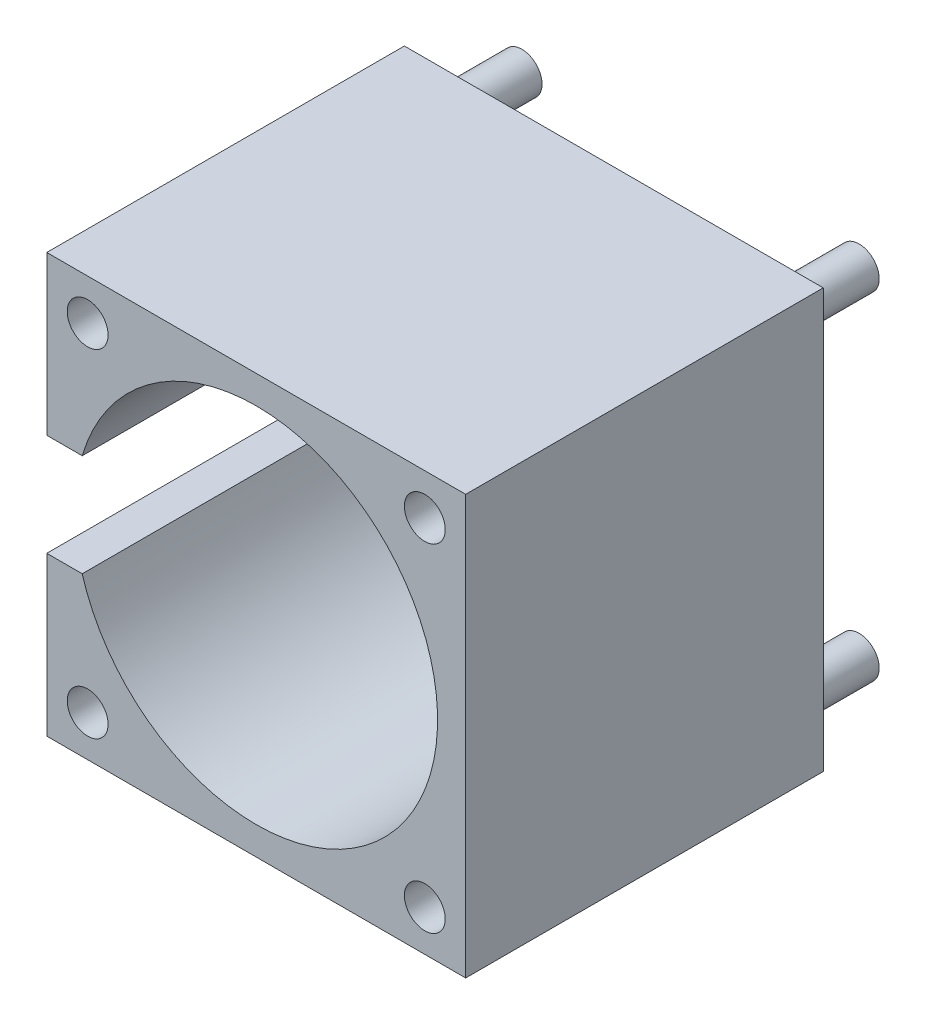
ISO-10303-21;
HEADER;
FILE_DESCRIPTION(('STEP AP214'),'2;1');
FILE_NAME('part.step','',(''),(''),'','','');
FILE_SCHEMA(('AUTOMOTIVE_DESIGN { 1 0 10303 214 1 1 1 1 }'));
ENDSEC;
DATA;
#1=APPLICATION_CONTEXT('core data for automotive mechanical design processes');
#2=APPLICATION_PROTOCOL_DEFINITION('international standard','automotive_design',2000,#1);
#3=PRODUCT_CONTEXT('',#1,'mechanical');
#4=PRODUCT('Part','Part','',(#3));
#5=PRODUCT_RELATED_PRODUCT_CATEGORY('part','',(#4));
#6=PRODUCT_DEFINITION_FORMATION('','',#4);
#7=PRODUCT_DEFINITION_CONTEXT('part definition',#1,'design');
#8=PRODUCT_DEFINITION('design','',#6,#7);
#9=PRODUCT_DEFINITION_SHAPE('','',#8);
#10=(LENGTH_UNIT() NAMED_UNIT(*) SI_UNIT(.MILLI.,.METRE.));
#11=(NAMED_UNIT(*) PLANE_ANGLE_UNIT() SI_UNIT($,.RADIAN.));
#12=(NAMED_UNIT(*) SI_UNIT($,.STERADIAN.) SOLID_ANGLE_UNIT());
#13=UNCERTAINTY_MEASURE_WITH_UNIT(LENGTH_MEASURE(1.E-05),#10,'distance_accuracy_value','');
#14=(GEOMETRIC_REPRESENTATION_CONTEXT(3) GLOBAL_UNCERTAINTY_ASSIGNED_CONTEXT((#13)) GLOBAL_UNIT_ASSIGNED_CONTEXT((#10,
#11,#12)) REPRESENTATION_CONTEXT('',''));
#15=CARTESIAN_POINT('',(0.,0.,0.));
#16=DIRECTION('',(0.,0.,1.));
#17=DIRECTION('',(1.,0.,0.));
#18=AXIS2_PLACEMENT_3D('',#15,#16,#17);
#19=CARTESIAN_POINT('',(-41.,-41.,70.));
#20=DIRECTION('',(1.,0.,0.));
#21=DIRECTION('',(0.,0.,-1.));
#22=AXIS2_PLACEMENT_3D('',#19,#20,#21);
#23=PLANE('',#22);
#24=DIRECTION('',(0.,-1.,0.));
#25=VECTOR('',#24,1.);
#26=CARTESIAN_POINT('',(-41.,-41.,0.));
#27=LINE('',#26,#25);
#28=CARTESIAN_POINT('',(-41.,41.,0.));
#29=VERTEX_POINT('',#28);
#30=CARTESIAN_POINT('',(-41.,10.,0.));
#31=VERTEX_POINT('',#30);
#32=EDGE_CURVE('E140',#29,#31,#27,.T.);
#33=ORIENTED_EDGE('',*,*,#32,.T.);
#34=DIRECTION('',(0.,0.,1.));
#35=VECTOR('',#34,1.);
#36=CARTESIAN_POINT('',(-41.,10.,-0.001000000000001));
#37=LINE('',#36,#35);
#38=CARTESIAN_POINT('',(-41.,10.,70.));
#39=VERTEX_POINT('',#38);
#40=EDGE_CURVE('E118',#31,#39,#37,.T.);
#41=ORIENTED_EDGE('',*,*,#40,.T.);
#42=DIRECTION('',(0.,-1.,0.));
#43=VECTOR('',#42,1.);
#44=CARTESIAN_POINT('',(-41.,-41.,70.));
#45=LINE('',#44,#43);
#46=CARTESIAN_POINT('',(-41.,41.,70.));
#47=VERTEX_POINT('',#46);
#48=EDGE_CURVE('E129',#47,#39,#45,.T.);
#49=ORIENTED_EDGE('',*,*,#48,.F.);
#50=DIRECTION('',(0.,0.,-1.));
#51=VECTOR('',#50,1.);
#52=CARTESIAN_POINT('',(-41.,41.,70.));
#53=LINE('',#52,#51);
#54=EDGE_CURVE('E139',#47,#29,#53,.T.);
#55=ORIENTED_EDGE('',*,*,#54,.T.);
#56=EDGE_LOOP('',(#33,#41,#49,#55));
#57=FACE_BOUND('',#56,.T.);
#58=ADVANCED_FACE('F36',(#57),#23,.F.);
#59=CARTESIAN_POINT('',(0.,0.,70.));
#60=DIRECTION('',(0.,0.,-1.));
#61=DIRECTION('',(-1.,0.,0.));
#62=AXIS2_PLACEMENT_3D('',#59,#60,#61);
#63=PLANE('',#62);
#64=CARTESIAN_POINT('',(-32.9999999999981,-33.,70.));
#65=DIRECTION('',(0.,0.,1.));
#66=DIRECTION('',(1.,0.,0.));
#67=AXIS2_PLACEMENT_3D('',#64,#65,#66);
#68=CIRCLE('',#67,4.000000000001);
#69=CARTESIAN_POINT('',(-28.9999999999971,-33.,70.));
#70=VERTEX_POINT('',#69);
#71=EDGE_CURVE('E117',#70,#70,#68,.T.);
#72=ORIENTED_EDGE('',*,*,#71,.F.);
#73=EDGE_LOOP('',(#72));
#74=FACE_BOUND('',#73,.T.);
#75=CARTESIAN_POINT('',(33.0000000000019,-32.9999999999981,70.));
#76=DIRECTION('',(0.,0.,1.));
#77=DIRECTION('',(1.,0.,0.));
#78=AXIS2_PLACEMENT_3D('',#75,#76,#77);
#79=CIRCLE('',#78,4.00000000000001);
#80=CARTESIAN_POINT('',(37.0000000000019,-32.9999999999981,70.));
#81=VERTEX_POINT('',#80);
#82=EDGE_CURVE('E244',#81,#81,#79,.T.);
#83=ORIENTED_EDGE('',*,*,#82,.F.);
#84=EDGE_LOOP('',(#83));
#85=FACE_BOUND('',#84,.T.);
#86=CARTESIAN_POINT('',(33.,33.0000000000019,70.));
#87=DIRECTION('',(0.,0.,1.));
#88=DIRECTION('',(1.,0.,0.));
#89=AXIS2_PLACEMENT_3D('',#86,#87,#88);
#90=CIRCLE('',#89,4.);
#91=CARTESIAN_POINT('',(37.,33.0000000000019,70.));
#92=VERTEX_POINT('',#91);
#93=EDGE_CURVE('E126',#92,#92,#90,.T.);
#94=ORIENTED_EDGE('',*,*,#93,.F.);
#95=EDGE_LOOP('',(#94));
#96=FACE_BOUND('',#95,.T.);
#97=CARTESIAN_POINT('',(-33.,33.,70.));
#98=DIRECTION('',(0.,0.,1.));
#99=DIRECTION('',(1.,0.,0.));
#100=AXIS2_PLACEMENT_3D('',#97,#98,#99);
#101=CIRCLE('',#100,4.);
#102=CARTESIAN_POINT('',(-29.,33.,70.));
#103=VERTEX_POINT('',#102);
#104=EDGE_CURVE('E122',#103,#103,#101,.T.);
#105=ORIENTED_EDGE('',*,*,#104,.F.);
#106=EDGE_LOOP('',(#105));
#107=FACE_BOUND('',#106,.T.);
#108=ORIENTED_EDGE('',*,*,#48,.T.);
#109=DIRECTION('',(-1.,0.,0.));
#110=VECTOR('',#109,1.);
#111=CARTESIAN_POINT('',(-41.,10.,70.));
#112=LINE('',#111,#110);
#113=CARTESIAN_POINT('',(-34.0624426605022,10.,70.));
#114=VERTEX_POINT('',#113);
#115=EDGE_CURVE('E237',#114,#39,#112,.T.);
#116=ORIENTED_EDGE('',*,*,#115,.F.);
#117=CARTESIAN_POINT('',(0.,0.,70.));
#118=DIRECTION('',(0.,0.,1.));
#119=DIRECTION('',(1.,0.,0.));
#120=AXIS2_PLACEMENT_3D('',#117,#118,#119);
#121=CIRCLE('',#120,35.5);
#122=CARTESIAN_POINT('',(-34.0624426605022,-10.,70.));
#123=VERTEX_POINT('',#122);
#124=EDGE_CURVE('E121',#123,#114,#121,.T.);
#125=ORIENTED_EDGE('',*,*,#124,.F.);
#126=DIRECTION('',(1.,0.,0.));
#127=VECTOR('',#126,1.);
#128=CARTESIAN_POINT('',(-41.,-10.,70.));
#129=LINE('',#128,#127);
#130=CARTESIAN_POINT('',(-41.,-10.,70.));
#131=VERTEX_POINT('',#130);
#132=EDGE_CURVE('E59',#131,#123,#129,.T.);
#133=ORIENTED_EDGE('',*,*,#132,.F.);
#134=CARTESIAN_POINT('',(-41.,-41.,70.));
#135=VERTEX_POINT('',#134);
#136=EDGE_CURVE('E133',#131,#135,#45,.T.);
#137=ORIENTED_EDGE('',*,*,#136,.T.);
#138=DIRECTION('',(1.,0.,0.));
#139=VECTOR('',#138,1.);
#140=CARTESIAN_POINT('',(-41.,-41.,70.));
#141=LINE('',#140,#139);
#142=CARTESIAN_POINT('',(41.,-41.,70.));
#143=VERTEX_POINT('',#142);
#144=EDGE_CURVE('E132',#135,#143,#141,.T.);
#145=ORIENTED_EDGE('',*,*,#144,.T.);
#146=DIRECTION('',(0.,1.,0.));
#147=VECTOR('',#146,1.);
#148=CARTESIAN_POINT('',(41.,-41.,70.));
#149=LINE('',#148,#147);
#150=CARTESIAN_POINT('',(41.,41.,70.));
#151=VERTEX_POINT('',#150);
#152=EDGE_CURVE('E135',#143,#151,#149,.T.);
#153=ORIENTED_EDGE('',*,*,#152,.T.);
#154=DIRECTION('',(-1.,0.,0.));
#155=VECTOR('',#154,1.);
#156=CARTESIAN_POINT('',(-41.,41.,70.));
#157=LINE('',#156,#155);
#158=EDGE_CURVE('E137',#151,#47,#157,.T.);
#159=ORIENTED_EDGE('',*,*,#158,.T.);
#160=EDGE_LOOP('',(#108,#116,#125,#133,#137,#145,#153,#159));
#161=FACE_BOUND('',#160,.T.);
#162=ADVANCED_FACE('F195',(#74,#85,#96,#107,#161),#63,.F.);
#163=CARTESIAN_POINT('',(0.,0.,0.));
#164=DIRECTION('',(0.,0.,-1.));
#165=DIRECTION('',(-1.,0.,0.));
#166=AXIS2_PLACEMENT_3D('',#163,#164,#165);
#167=PLANE('',#166);
#168=CARTESIAN_POINT('',(33.,-33.,0.));
#169=DIRECTION('',(0.,0.,-1.));
#170=DIRECTION('',(1.,0.,0.));
#171=AXIS2_PLACEMENT_3D('',#168,#169,#170);
#172=CIRCLE('',#171,3.95);
#173=CARTESIAN_POINT('',(36.95,-33.,0.));
#174=VERTEX_POINT('',#173);
#175=EDGE_CURVE('E512',#174,#174,#172,.T.);
#176=ORIENTED_EDGE('',*,*,#175,.F.);
#177=EDGE_LOOP('',(#176));
#178=FACE_BOUND('',#177,.T.);
#179=CARTESIAN_POINT('',(-33.,-33.,0.));
#180=DIRECTION('',(0.,0.,-1.));
#181=DIRECTION('',(1.,0.,0.));
#182=AXIS2_PLACEMENT_3D('',#179,#180,#181);
#183=CIRCLE('',#182,3.95);
#184=CARTESIAN_POINT('',(-29.05,-33.,0.));
#185=VERTEX_POINT('',#184);
#186=EDGE_CURVE('E511',#185,#185,#183,.T.);
#187=ORIENTED_EDGE('',*,*,#186,.F.);
#188=EDGE_LOOP('',(#187));
#189=FACE_BOUND('',#188,.T.);
#190=CARTESIAN_POINT('',(33.,33.,0.));
#191=DIRECTION('',(0.,0.,-1.));
#192=DIRECTION('',(-1.,0.,0.));
#193=AXIS2_PLACEMENT_3D('',#190,#191,#192);
#194=CIRCLE('',#193,3.95);
#195=CARTESIAN_POINT('',(29.05,33.,0.));
#196=VERTEX_POINT('',#195);
#197=EDGE_CURVE('E521',#196,#196,#194,.T.);
#198=ORIENTED_EDGE('',*,*,#197,.F.);
#199=EDGE_LOOP('',(#198));
#200=FACE_BOUND('',#199,.T.);
#201=CARTESIAN_POINT('',(-33.,33.,0.));
#202=DIRECTION('',(0.,0.,-1.));
#203=DIRECTION('',(-1.,0.,0.));
#204=AXIS2_PLACEMENT_3D('',#201,#202,#203);
#205=CIRCLE('',#204,3.95);
#206=CARTESIAN_POINT('',(-36.95,33.,0.));
#207=VERTEX_POINT('',#206);
#208=EDGE_CURVE('E526',#207,#207,#205,.T.);
#209=ORIENTED_EDGE('',*,*,#208,.F.);
#210=EDGE_LOOP('',(#209));
#211=FACE_BOUND('',#210,.T.);
#212=DIRECTION('',(-1.,0.,0.));
#213=VECTOR('',#212,1.);
#214=CARTESIAN_POINT('',(-41.,10.,0.));
#215=LINE('',#214,#213);
#216=CARTESIAN_POINT('',(-34.0624426605022,10.,0.));
#217=VERTEX_POINT('',#216);
#218=EDGE_CURVE('E51',#217,#31,#215,.T.);
#219=ORIENTED_EDGE('',*,*,#218,.T.);
#220=ORIENTED_EDGE('',*,*,#32,.F.);
#221=DIRECTION('',(-1.,0.,0.));
#222=VECTOR('',#221,1.);
#223=CARTESIAN_POINT('',(-41.,41.,0.));
#224=LINE('',#223,#222);
#225=CARTESIAN_POINT('',(41.,41.,0.));
#226=VERTEX_POINT('',#225);
#227=EDGE_CURVE('E147',#226,#29,#224,.T.);
#228=ORIENTED_EDGE('',*,*,#227,.F.);
#229=DIRECTION('',(0.,1.,0.));
#230=VECTOR('',#229,1.);
#231=CARTESIAN_POINT('',(41.,-41.,0.));
#232=LINE('',#231,#230);
#233=CARTESIAN_POINT('',(41.,-41.,0.));
#234=VERTEX_POINT('',#233);
#235=EDGE_CURVE('E145',#234,#226,#232,.T.);
#236=ORIENTED_EDGE('',*,*,#235,.F.);
#237=DIRECTION('',(1.,0.,0.));
#238=VECTOR('',#237,1.);
#239=CARTESIAN_POINT('',(-41.,-41.,0.));
#240=LINE('',#239,#238);
#241=CARTESIAN_POINT('',(-41.,-41.,0.));
#242=VERTEX_POINT('',#241);
#243=EDGE_CURVE('E143',#242,#234,#240,.T.);
#244=ORIENTED_EDGE('',*,*,#243,.F.);
#245=CARTESIAN_POINT('',(-41.,-10.,0.));
#246=VERTEX_POINT('',#245);
#247=EDGE_CURVE('E116',#246,#242,#27,.T.);
#248=ORIENTED_EDGE('',*,*,#247,.F.);
#249=DIRECTION('',(1.,0.,0.));
#250=VECTOR('',#249,1.);
#251=CARTESIAN_POINT('',(-41.,-10.,0.));
#252=LINE('',#251,#250);
#253=CARTESIAN_POINT('',(-34.0624426605022,-10.,0.));
#254=VERTEX_POINT('',#253);
#255=EDGE_CURVE('E101',#246,#254,#252,.T.);
#256=ORIENTED_EDGE('',*,*,#255,.T.);
#257=CARTESIAN_POINT('',(0.,0.,0.));
#258=DIRECTION('',(0.,0.,1.));
#259=DIRECTION('',(1.,0.,0.));
#260=AXIS2_PLACEMENT_3D('',#257,#258,#259);
#261=CIRCLE('',#260,35.5);
#262=EDGE_CURVE('E114',#254,#217,#261,.T.);
#263=ORIENTED_EDGE('',*,*,#262,.T.);
#264=EDGE_LOOP('',(#219,#220,#228,#236,#244,#248,#256,#263));
#265=FACE_BOUND('',#264,.T.);
#266=ADVANCED_FACE('F113',(#178,#189,#200,#211,#265),#167,.T.);
#267=ORIENTED_EDGE('',*,*,#136,.F.);
#268=DIRECTION('',(0.,0.,1.));
#269=VECTOR('',#268,1.);
#270=CARTESIAN_POINT('',(-41.,-10.,-0.001000000000001));
#271=LINE('',#270,#269);
#272=EDGE_CURVE('E219',#246,#131,#271,.T.);
#273=ORIENTED_EDGE('',*,*,#272,.F.);
#274=ORIENTED_EDGE('',*,*,#247,.T.);
#275=DIRECTION('',(0.,0.,-1.));
#276=VECTOR('',#275,1.);
#277=CARTESIAN_POINT('',(-41.,-41.,70.));
#278=LINE('',#277,#276);
#279=EDGE_CURVE('E157',#135,#242,#278,.T.);
#280=ORIENTED_EDGE('',*,*,#279,.F.);
#281=EDGE_LOOP('',(#267,#273,#274,#280));
#282=FACE_BOUND('',#281,.T.);
#283=ADVANCED_FACE('F198',(#282),#23,.F.);
#284=CARTESIAN_POINT('',(-41.,-41.,70.));
#285=DIRECTION('',(0.,1.,0.));
#286=DIRECTION('',(0.,0.,1.));
#287=AXIS2_PLACEMENT_3D('',#284,#285,#286);
#288=PLANE('',#287);
#289=ORIENTED_EDGE('',*,*,#243,.T.);
#290=DIRECTION('',(0.,0.,-1.));
#291=VECTOR('',#290,1.);
#292=CARTESIAN_POINT('',(41.,-41.,70.));
#293=LINE('',#292,#291);
#294=EDGE_CURVE('E154',#143,#234,#293,.T.);
#295=ORIENTED_EDGE('',*,*,#294,.F.);
#296=ORIENTED_EDGE('',*,*,#144,.F.);
#297=ORIENTED_EDGE('',*,*,#279,.T.);
#298=EDGE_LOOP('',(#289,#295,#296,#297));
#299=FACE_BOUND('',#298,.T.);
#300=ADVANCED_FACE('F207',(#299),#288,.F.);
#301=CARTESIAN_POINT('',(41.,-41.,70.));
#302=DIRECTION('',(-1.,0.,0.));
#303=DIRECTION('',(0.,0.,1.));
#304=AXIS2_PLACEMENT_3D('',#301,#302,#303);
#305=PLANE('',#304);
#306=ORIENTED_EDGE('',*,*,#235,.T.);
#307=DIRECTION('',(0.,0.,-1.));
#308=VECTOR('',#307,1.);
#309=CARTESIAN_POINT('',(41.,41.,70.));
#310=LINE('',#309,#308);
#311=EDGE_CURVE('E151',#151,#226,#310,.T.);
#312=ORIENTED_EDGE('',*,*,#311,.F.);
#313=ORIENTED_EDGE('',*,*,#152,.F.);
#314=ORIENTED_EDGE('',*,*,#294,.T.);
#315=EDGE_LOOP('',(#306,#312,#313,#314));
#316=FACE_BOUND('',#315,.T.);
#317=ADVANCED_FACE('F213',(#316),#305,.F.);
#318=CARTESIAN_POINT('',(-41.,41.,70.));
#319=DIRECTION('',(0.,-1.,0.));
#320=DIRECTION('',(0.,0.,-1.));
#321=AXIS2_PLACEMENT_3D('',#318,#319,#320);
#322=PLANE('',#321);
#323=ORIENTED_EDGE('',*,*,#227,.T.);
#324=ORIENTED_EDGE('',*,*,#54,.F.);
#325=ORIENTED_EDGE('',*,*,#158,.F.);
#326=ORIENTED_EDGE('',*,*,#311,.T.);
#327=EDGE_LOOP('',(#323,#324,#325,#326));
#328=FACE_BOUND('',#327,.T.);
#329=ADVANCED_FACE('F232',(#328),#322,.F.);
#330=CARTESIAN_POINT('',(0.,0.,70.));
#331=DIRECTION('',(0.,0.,-1.));
#332=DIRECTION('',(-1.,0.,0.));
#333=AXIS2_PLACEMENT_3D('',#330,#331,#332);
#334=CYLINDRICAL_SURFACE('',#333,35.5);
#335=DIRECTION('',(0.,0.,-1.));
#336=VECTOR('',#335,1.);
#337=CARTESIAN_POINT('',(-34.0624426605022,10.,70.));
#338=LINE('',#337,#336);
#339=EDGE_CURVE('E107',#114,#217,#338,.T.);
#340=ORIENTED_EDGE('',*,*,#339,.T.);
#341=ORIENTED_EDGE('',*,*,#262,.F.);
#342=DIRECTION('',(0.,0.,-1.));
#343=VECTOR('',#342,1.);
#344=CARTESIAN_POINT('',(-34.0624426605022,-10.,70.));
#345=LINE('',#344,#343);
#346=EDGE_CURVE('E98',#254,#123,#345,.F.);
#347=ORIENTED_EDGE('',*,*,#346,.T.);
#348=ORIENTED_EDGE('',*,*,#124,.T.);
#349=EDGE_LOOP('',(#340,#341,#347,#348));
#350=FACE_BOUND('',#349,.T.);
#351=ADVANCED_FACE('F120',(#350),#334,.F.);
#352=CARTESIAN_POINT('',(-33.,33.,50.));
#353=DIRECTION('',(0.,0.,1.));
#354=DIRECTION('',(1.,0.,0.));
#355=AXIS2_PLACEMENT_3D('',#352,#353,#354);
#356=CYLINDRICAL_SURFACE('',#355,4.);
#357=CARTESIAN_POINT('',(-33.,33.,53.));
#358=DIRECTION('',(0.,0.,1.));
#359=DIRECTION('',(1.,0.,0.));
#360=AXIS2_PLACEMENT_3D('',#357,#358,#359);
#361=CIRCLE('',#360,4.);
#362=CARTESIAN_POINT('',(-29.,33.,53.));
#363=VERTEX_POINT('',#362);
#364=EDGE_CURVE('E163',#363,#363,#361,.F.);
#365=ORIENTED_EDGE('',*,*,#364,.T.);
#366=EDGE_LOOP('',(#365));
#367=FACE_BOUND('',#366,.T.);
#368=ORIENTED_EDGE('',*,*,#104,.T.);
#369=EDGE_LOOP('',(#368));
#370=FACE_BOUND('',#369,.T.);
#371=ADVANCED_FACE('F258',(#367,#370),#356,.F.);
#372=CARTESIAN_POINT('',(-33.,33.,50.));
#373=DIRECTION('',(0.,0.,1.));
#374=DIRECTION('',(1.,0.,0.));
#375=AXIS2_PLACEMENT_3D('',#372,#373,#374);
#376=PLANE('',#375);
#377=CARTESIAN_POINT('',(-33.,33.,50.));
#378=DIRECTION('',(0.,0.,1.));
#379=DIRECTION('',(1.,0.,0.));
#380=AXIS2_PLACEMENT_3D('',#377,#378,#379);
#381=CIRCLE('',#380,1.);
#382=CARTESIAN_POINT('',(-32.,33.,50.));
#383=VERTEX_POINT('',#382);
#384=EDGE_CURVE('E160',#383,#383,#381,.T.);
#385=ORIENTED_EDGE('',*,*,#384,.T.);
#386=EDGE_LOOP('',(#385));
#387=FACE_BOUND('',#386,.T.);
#388=ADVANCED_FACE('F260',(#387),#376,.T.);
#389=CARTESIAN_POINT('',(33.,33.0000000000019,50.));
#390=DIRECTION('',(0.,0.,1.));
#391=DIRECTION('',(1.,0.,0.));
#392=AXIS2_PLACEMENT_3D('',#389,#390,#391);
#393=CYLINDRICAL_SURFACE('',#392,4.);
#394=CARTESIAN_POINT('',(33.,33.0000000000019,53.));
#395=DIRECTION('',(0.,0.,1.));
#396=DIRECTION('',(1.,0.,0.));
#397=AXIS2_PLACEMENT_3D('',#394,#395,#396);
#398=CIRCLE('',#397,4.);
#399=CARTESIAN_POINT('',(37.,33.0000000000019,53.));
#400=VERTEX_POINT('',#399);
#401=EDGE_CURVE('E169',#400,#400,#398,.F.);
#402=ORIENTED_EDGE('',*,*,#401,.T.);
#403=EDGE_LOOP('',(#402));
#404=FACE_BOUND('',#403,.T.);
#405=ORIENTED_EDGE('',*,*,#93,.T.);
#406=EDGE_LOOP('',(#405));
#407=FACE_BOUND('',#406,.T.);
#408=ADVANCED_FACE('F267',(#404,#407),#393,.F.);
#409=CARTESIAN_POINT('',(33.,33.0000000000019,50.));
#410=DIRECTION('',(0.,0.,1.));
#411=DIRECTION('',(1.,0.,0.));
#412=AXIS2_PLACEMENT_3D('',#409,#410,#411);
#413=PLANE('',#412);
#414=CARTESIAN_POINT('',(33.,33.0000000000019,50.));
#415=DIRECTION('',(0.,0.,1.));
#416=DIRECTION('',(1.,0.,0.));
#417=AXIS2_PLACEMENT_3D('',#414,#415,#416);
#418=CIRCLE('',#417,0.999999999999997);
#419=CARTESIAN_POINT('',(34.,33.0000000000019,50.));
#420=VERTEX_POINT('',#419);
#421=EDGE_CURVE('E166',#420,#420,#418,.T.);
#422=ORIENTED_EDGE('',*,*,#421,.T.);
#423=EDGE_LOOP('',(#422));
#424=FACE_BOUND('',#423,.T.);
#425=ADVANCED_FACE('F400',(#424),#413,.T.);
#426=CARTESIAN_POINT('',(33.0000000000019,-32.9999999999981,50.));
#427=DIRECTION('',(0.,0.,1.));
#428=DIRECTION('',(1.,0.,0.));
#429=AXIS2_PLACEMENT_3D('',#426,#427,#428);
#430=CYLINDRICAL_SURFACE('',#429,4.00000000000001);
#431=CARTESIAN_POINT('',(33.0000000000019,-32.9999999999981,53.));
#432=DIRECTION('',(0.,0.,1.));
#433=DIRECTION('',(1.,0.,0.));
#434=AXIS2_PLACEMENT_3D('',#431,#432,#433);
#435=CIRCLE('',#434,4.00000000000001);
#436=CARTESIAN_POINT('',(37.0000000000019,-32.9999999999981,53.));
#437=VERTEX_POINT('',#436);
#438=EDGE_CURVE('E11',#437,#437,#435,.F.);
#439=ORIENTED_EDGE('',*,*,#438,.T.);
#440=EDGE_LOOP('',(#439));
#441=FACE_BOUND('',#440,.T.);
#442=ORIENTED_EDGE('',*,*,#82,.T.);
#443=EDGE_LOOP('',(#442));
#444=FACE_BOUND('',#443,.T.);
#445=ADVANCED_FACE('F403',(#441,#444),#430,.F.);
#446=CARTESIAN_POINT('',(33.0000000000019,-32.9999999999981,50.));
#447=DIRECTION('',(0.,0.,1.));
#448=DIRECTION('',(1.,0.,0.));
#449=AXIS2_PLACEMENT_3D('',#446,#447,#448);
#450=PLANE('',#449);
#451=CARTESIAN_POINT('',(33.0000000000019,-32.9999999999981,50.));
#452=DIRECTION('',(0.,0.,1.));
#453=DIRECTION('',(1.,0.,0.));
#454=AXIS2_PLACEMENT_3D('',#451,#452,#453);
#455=CIRCLE('',#454,1.00000000000001);
#456=CARTESIAN_POINT('',(34.0000000000019,-32.9999999999981,50.));
#457=VERTEX_POINT('',#456);
#458=EDGE_CURVE('E44',#457,#457,#455,.T.);
#459=ORIENTED_EDGE('',*,*,#458,.T.);
#460=EDGE_LOOP('',(#459));
#461=FACE_BOUND('',#460,.T.);
#462=ADVANCED_FACE('F180',(#461),#450,.T.);
#463=CARTESIAN_POINT('',(-32.9999999999981,-33.,50.));
#464=DIRECTION('',(0.,0.,1.));
#465=DIRECTION('',(1.,0.,0.));
#466=AXIS2_PLACEMENT_3D('',#463,#464,#465);
#467=CYLINDRICAL_SURFACE('',#466,4.000000000001);
#468=CARTESIAN_POINT('',(-32.9999999999981,-33.,53.));
#469=DIRECTION('',(0.,0.,1.));
#470=DIRECTION('',(1.,0.,0.));
#471=AXIS2_PLACEMENT_3D('',#468,#469,#470);
#472=CIRCLE('',#471,4.000000000001);
#473=CARTESIAN_POINT('',(-28.9999999999971,-33.,53.));
#474=VERTEX_POINT('',#473);
#475=EDGE_CURVE('E175',#474,#474,#472,.F.);
#476=ORIENTED_EDGE('',*,*,#475,.T.);
#477=EDGE_LOOP('',(#476));
#478=FACE_BOUND('',#477,.T.);
#479=ORIENTED_EDGE('',*,*,#71,.T.);
#480=EDGE_LOOP('',(#479));
#481=FACE_BOUND('',#480,.T.);
#482=ADVANCED_FACE('F250',(#478,#481),#467,.F.);
#483=CARTESIAN_POINT('',(-32.9999999999981,-33.,50.));
#484=DIRECTION('',(0.,0.,1.));
#485=DIRECTION('',(1.,0.,0.));
#486=AXIS2_PLACEMENT_3D('',#483,#484,#485);
#487=PLANE('',#486);
#488=CARTESIAN_POINT('',(-32.9999999999981,-33.,50.));
#489=DIRECTION('',(0.,0.,1.));
#490=DIRECTION('',(1.,0.,0.));
#491=AXIS2_PLACEMENT_3D('',#488,#489,#490);
#492=CIRCLE('',#491,1.000000000001);
#493=CARTESIAN_POINT('',(-31.9999999999971,-33.,50.));
#494=VERTEX_POINT('',#493);
#495=EDGE_CURVE('E172',#494,#494,#492,.T.);
#496=ORIENTED_EDGE('',*,*,#495,.T.);
#497=EDGE_LOOP('',(#496));
#498=FACE_BOUND('',#497,.T.);
#499=ADVANCED_FACE('F413',(#498),#487,.T.);
#500=CARTESIAN_POINT('',(-33.,33.,53.));
#501=DIRECTION('',(0.,0.,1.));
#502=DIRECTION('',(1.,0.,0.));
#503=AXIS2_PLACEMENT_3D('',#500,#501,#502);
#504=DEGENERATE_TOROIDAL_SURFACE('',#503,1.,3.,.T.);
#505=ORIENTED_EDGE('',*,*,#364,.F.);
#506=EDGE_LOOP('',(#505));
#507=FACE_BOUND('',#506,.T.);
#508=ORIENTED_EDGE('',*,*,#384,.F.);
#509=EDGE_LOOP('',(#508));
#510=FACE_BOUND('',#509,.T.);
#511=ADVANCED_FACE('F415',(#507,#510),#504,.F.);
#512=CARTESIAN_POINT('',(33.,33.0000000000019,53.));
#513=DIRECTION('',(0.,0.,1.));
#514=DIRECTION('',(1.,0.,0.));
#515=AXIS2_PLACEMENT_3D('',#512,#513,#514);
#516=DEGENERATE_TOROIDAL_SURFACE('',#515,0.999999999999997,3.,.T.);
#517=ORIENTED_EDGE('',*,*,#401,.F.);
#518=EDGE_LOOP('',(#517));
#519=FACE_BOUND('',#518,.T.);
#520=ORIENTED_EDGE('',*,*,#421,.F.);
#521=EDGE_LOOP('',(#520));
#522=FACE_BOUND('',#521,.T.);
#523=ADVANCED_FACE('F191',(#519,#522),#516,.F.);
#524=CARTESIAN_POINT('',(-32.9999999999981,-33.,53.));
#525=DIRECTION('',(0.,0.,1.));
#526=DIRECTION('',(1.,0.,0.));
#527=AXIS2_PLACEMENT_3D('',#524,#525,#526);
#528=DEGENERATE_TOROIDAL_SURFACE('',#527,1.000000000001,3.,.T.);
#529=ORIENTED_EDGE('',*,*,#475,.F.);
#530=EDGE_LOOP('',(#529));
#531=FACE_BOUND('',#530,.T.);
#532=ORIENTED_EDGE('',*,*,#495,.F.);
#533=EDGE_LOOP('',(#532));
#534=FACE_BOUND('',#533,.T.);
#535=ADVANCED_FACE('F183',(#531,#534),#528,.F.);
#536=CARTESIAN_POINT('',(33.0000000000019,-32.9999999999981,53.));
#537=DIRECTION('',(0.,0.,1.));
#538=DIRECTION('',(1.,0.,0.));
#539=AXIS2_PLACEMENT_3D('',#536,#537,#538);
#540=DEGENERATE_TOROIDAL_SURFACE('',#539,1.00000000000001,3.,.T.);
#541=ORIENTED_EDGE('',*,*,#438,.F.);
#542=EDGE_LOOP('',(#541));
#543=FACE_BOUND('',#542,.T.);
#544=ORIENTED_EDGE('',*,*,#458,.F.);
#545=EDGE_LOOP('',(#544));
#546=FACE_BOUND('',#545,.T.);
#547=ADVANCED_FACE('F38',(#543,#546),#540,.F.);
#548=CARTESIAN_POINT('',(-41.,-10.,-0.001000000000001));
#549=DIRECTION('',(0.,-1.,0.));
#550=DIRECTION('',(0.,0.,-1.));
#551=AXIS2_PLACEMENT_3D('',#548,#549,#550);
#552=PLANE('',#551);
#553=ORIENTED_EDGE('',*,*,#272,.T.);
#554=ORIENTED_EDGE('',*,*,#132,.T.);
#555=ORIENTED_EDGE('',*,*,#346,.F.);
#556=ORIENTED_EDGE('',*,*,#255,.F.);
#557=EDGE_LOOP('',(#553,#554,#555,#556));
#558=FACE_BOUND('',#557,.T.);
#559=ADVANCED_FACE('F100',(#558),#552,.F.);
#560=CARTESIAN_POINT('',(-41.,10.,-0.001000000000001));
#561=DIRECTION('',(0.,1.,0.));
#562=DIRECTION('',(0.,0.,1.));
#563=AXIS2_PLACEMENT_3D('',#560,#561,#562);
#564=PLANE('',#563);
#565=ORIENTED_EDGE('',*,*,#339,.F.);
#566=ORIENTED_EDGE('',*,*,#115,.T.);
#567=ORIENTED_EDGE('',*,*,#40,.F.);
#568=ORIENTED_EDGE('',*,*,#218,.F.);
#569=EDGE_LOOP('',(#565,#566,#567,#568));
#570=FACE_BOUND('',#569,.T.);
#571=ADVANCED_FACE('F189',(#570),#564,.F.);
#572=CARTESIAN_POINT('',(-33.,33.,-15.));
#573=DIRECTION('',(0.,0.,1.));
#574=DIRECTION('',(1.,0.,0.));
#575=AXIS2_PLACEMENT_3D('',#572,#573,#574);
#576=CYLINDRICAL_SURFACE('',#575,3.95);
#577=CARTESIAN_POINT('',(-33.,33.,-15.));
#578=DIRECTION('',(0.,0.,-1.));
#579=DIRECTION('',(-1.,0.,0.));
#580=AXIS2_PLACEMENT_3D('',#577,#578,#579);
#581=CIRCLE('',#580,3.95);
#582=CARTESIAN_POINT('',(-36.95,33.,-15.));
#583=VERTEX_POINT('',#582);
#584=EDGE_CURVE('E108',#583,#583,#581,.T.);
#585=ORIENTED_EDGE('',*,*,#584,.F.);
#586=EDGE_LOOP('',(#585));
#587=FACE_BOUND('',#586,.T.);
#588=ORIENTED_EDGE('',*,*,#208,.T.);
#589=EDGE_LOOP('',(#588));
#590=FACE_BOUND('',#589,.T.);
#591=ADVANCED_FACE('F308',(#587,#590),#576,.T.);
#592=CARTESIAN_POINT('',(-33.,33.,-15.));
#593=DIRECTION('',(0.,0.,-1.));
#594=DIRECTION('',(-1.,0.,0.));
#595=AXIS2_PLACEMENT_3D('',#592,#593,#594);
#596=PLANE('',#595);
#597=ORIENTED_EDGE('',*,*,#584,.T.);
#598=EDGE_LOOP('',(#597));
#599=FACE_BOUND('',#598,.T.);
#600=ADVANCED_FACE('F324',(#599),#596,.T.);
#601=CARTESIAN_POINT('',(33.,33.,-15.));
#602=DIRECTION('',(0.,0.,1.));
#603=DIRECTION('',(1.,0.,0.));
#604=AXIS2_PLACEMENT_3D('',#601,#602,#603);
#605=CYLINDRICAL_SURFACE('',#604,3.95);
#606=CARTESIAN_POINT('',(33.,33.,-15.));
#607=DIRECTION('',(0.,0.,-1.));
#608=DIRECTION('',(-1.,0.,0.));
#609=AXIS2_PLACEMENT_3D('',#606,#607,#608);
#610=CIRCLE('',#609,3.95);
#611=CARTESIAN_POINT('',(29.05,33.,-15.));
#612=VERTEX_POINT('',#611);
#613=EDGE_CURVE('E523',#612,#612,#610,.T.);
#614=ORIENTED_EDGE('',*,*,#613,.F.);
#615=EDGE_LOOP('',(#614));
#616=FACE_BOUND('',#615,.T.);
#617=ORIENTED_EDGE('',*,*,#197,.T.);
#618=EDGE_LOOP('',(#617));
#619=FACE_BOUND('',#618,.T.);
#620=ADVANCED_FACE('F334',(#616,#619),#605,.T.);
#621=CARTESIAN_POINT('',(33.,33.,-15.));
#622=DIRECTION('',(0.,0.,-1.));
#623=DIRECTION('',(-1.,0.,0.));
#624=AXIS2_PLACEMENT_3D('',#621,#622,#623);
#625=PLANE('',#624);
#626=ORIENTED_EDGE('',*,*,#613,.T.);
#627=EDGE_LOOP('',(#626));
#628=FACE_BOUND('',#627,.T.);
#629=ADVANCED_FACE('F344',(#628),#625,.T.);
#630=CARTESIAN_POINT('',(-33.,-33.,-15.));
#631=DIRECTION('',(0.,0.,1.));
#632=DIRECTION('',(1.,0.,0.));
#633=AXIS2_PLACEMENT_3D('',#630,#631,#632);
#634=CYLINDRICAL_SURFACE('',#633,3.95);
#635=CARTESIAN_POINT('',(-33.,-33.,-15.));
#636=DIRECTION('',(0.,0.,-1.));
#637=DIRECTION('',(1.,0.,0.));
#638=AXIS2_PLACEMENT_3D('',#635,#636,#637);
#639=CIRCLE('',#638,3.95);
#640=CARTESIAN_POINT('',(-29.05,-33.,-15.));
#641=VERTEX_POINT('',#640);
#642=EDGE_CURVE('E515',#641,#641,#639,.T.);
#643=ORIENTED_EDGE('',*,*,#642,.F.);
#644=EDGE_LOOP('',(#643));
#645=FACE_BOUND('',#644,.T.);
#646=ORIENTED_EDGE('',*,*,#186,.T.);
#647=EDGE_LOOP('',(#646));
#648=FACE_BOUND('',#647,.T.);
#649=ADVANCED_FACE('F354',(#645,#648),#634,.T.);
#650=CARTESIAN_POINT('',(-33.,-33.,-15.));
#651=DIRECTION('',(0.,0.,1.));
#652=DIRECTION('',(1.,0.,0.));
#653=AXIS2_PLACEMENT_3D('',#650,#651,#652);
#654=PLANE('',#653);
#655=ORIENTED_EDGE('',*,*,#642,.T.);
#656=EDGE_LOOP('',(#655));
#657=FACE_BOUND('',#656,.T.);
#658=ADVANCED_FACE('F364',(#657),#654,.F.);
#659=CARTESIAN_POINT('',(33.,-33.,-15.));
#660=DIRECTION('',(0.,0.,1.));
#661=DIRECTION('',(1.,0.,0.));
#662=AXIS2_PLACEMENT_3D('',#659,#660,#661);
#663=CYLINDRICAL_SURFACE('',#662,3.95);
#664=CARTESIAN_POINT('',(33.,-33.,-15.));
#665=DIRECTION('',(0.,0.,-1.));
#666=DIRECTION('',(1.,0.,0.));
#667=AXIS2_PLACEMENT_3D('',#664,#665,#666);
#668=CIRCLE('',#667,3.95);
#669=CARTESIAN_POINT('',(36.95,-33.,-15.));
#670=VERTEX_POINT('',#669);
#671=EDGE_CURVE('E510',#670,#670,#668,.T.);
#672=ORIENTED_EDGE('',*,*,#671,.F.);
#673=EDGE_LOOP('',(#672));
#674=FACE_BOUND('',#673,.T.);
#675=ORIENTED_EDGE('',*,*,#175,.T.);
#676=EDGE_LOOP('',(#675));
#677=FACE_BOUND('',#676,.T.);
#678=ADVANCED_FACE('F374',(#674,#677),#663,.T.);
#679=CARTESIAN_POINT('',(33.,-33.,-15.));
#680=DIRECTION('',(0.,0.,1.));
#681=DIRECTION('',(1.,0.,0.));
#682=AXIS2_PLACEMENT_3D('',#679,#680,#681);
#683=PLANE('',#682);
#684=ORIENTED_EDGE('',*,*,#671,.T.);
#685=EDGE_LOOP('',(#684));
#686=FACE_BOUND('',#685,.T.);
#687=ADVANCED_FACE('F384',(#686),#683,.F.);
#688=CLOSED_SHELL('',(#58,#162,#266,#283,#300,#317,#329,#351,#371,#388,#408,#425,#445,#462,#482,
#499,#511,#523,#535,#547,#559,#571,#591,#600,#620,#629,#649,#658,#678,#687));
#689=MANIFOLD_SOLID_BREP('B2',#688);
#690=ADVANCED_BREP_SHAPE_REPRESENTATION('',(#18,#689),#14);
#691=SHAPE_DEFINITION_REPRESENTATION(#9,#690);
ENDSEC;
END-ISO-10303-21;
